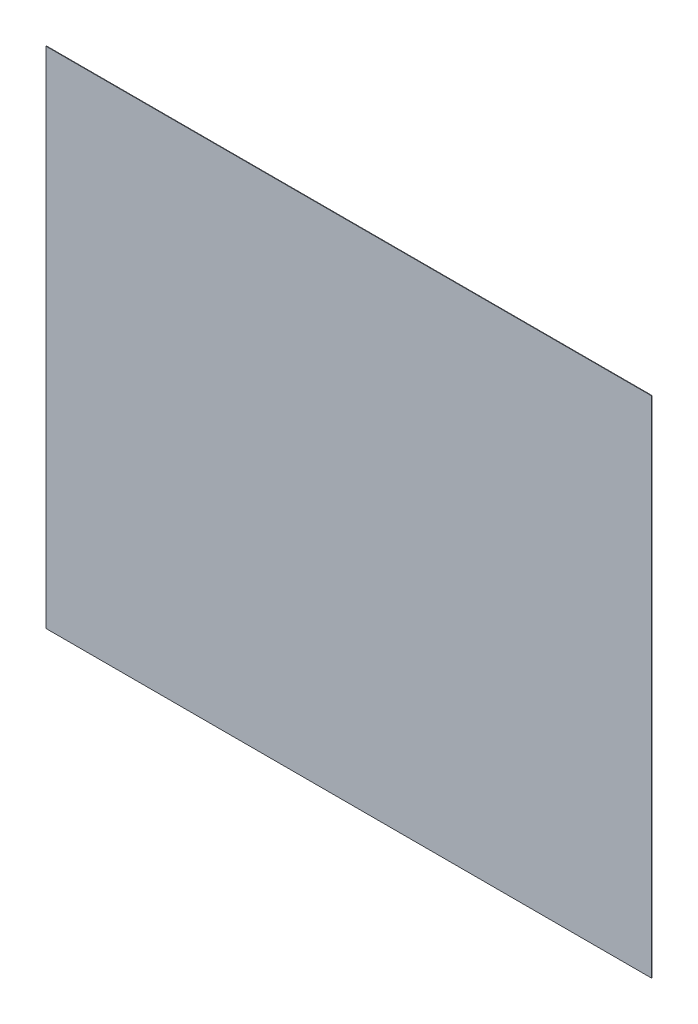
ISO-10303-21;
HEADER;
FILE_DESCRIPTION(('STEP AP214'),'2;1');
FILE_NAME('part.step','',(''),(''),'','','');
FILE_SCHEMA(('AUTOMOTIVE_DESIGN { 1 0 10303 214 1 1 1 1 }'));
ENDSEC;
DATA;
#1=APPLICATION_CONTEXT('core data for automotive mechanical design processes');
#2=APPLICATION_PROTOCOL_DEFINITION('international standard','automotive_design',2000,#1);
#3=PRODUCT_CONTEXT('',#1,'mechanical');
#4=PRODUCT('Part','Part','',(#3));
#5=PRODUCT_RELATED_PRODUCT_CATEGORY('part','',(#4));
#6=PRODUCT_DEFINITION_FORMATION('','',#4);
#7=PRODUCT_DEFINITION_CONTEXT('part definition',#1,'design');
#8=PRODUCT_DEFINITION('design','',#6,#7);
#9=PRODUCT_DEFINITION_SHAPE('','',#8);
#10=(LENGTH_UNIT() NAMED_UNIT(*) SI_UNIT(.MILLI.,.METRE.));
#11=(NAMED_UNIT(*) PLANE_ANGLE_UNIT() SI_UNIT($,.RADIAN.));
#12=(NAMED_UNIT(*) SI_UNIT($,.STERADIAN.) SOLID_ANGLE_UNIT());
#13=UNCERTAINTY_MEASURE_WITH_UNIT(LENGTH_MEASURE(1.E-05),#10,'distance_accuracy_value','');
#14=(GEOMETRIC_REPRESENTATION_CONTEXT(3) GLOBAL_UNCERTAINTY_ASSIGNED_CONTEXT((#13)) GLOBAL_UNIT_ASSIGNED_CONTEXT((#10,
#11,#12)) REPRESENTATION_CONTEXT('',''));
#15=CARTESIAN_POINT('',(0.,0.,0.));
#16=DIRECTION('',(0.,0.,1.));
#17=DIRECTION('',(1.,0.,0.));
#18=AXIS2_PLACEMENT_3D('',#15,#16,#17);
#19=CARTESIAN_POINT('',(0.,0.,0.01));
#20=DIRECTION('',(0.,0.,1.));
#21=DIRECTION('',(1.,0.,0.));
#22=AXIS2_PLACEMENT_3D('',#19,#20,#21);
#23=PLANE('',#22);
#24=DIRECTION('',(1.,0.,0.));
#25=VECTOR('',#24,1.);
#26=CARTESIAN_POINT('',(12.,10.,0.01));
#27=LINE('',#26,#25);
#28=CARTESIAN_POINT('',(0.,10.,0.01));
#29=VERTEX_POINT('',#28);
#30=CARTESIAN_POINT('',(12.,10.,0.01));
#31=VERTEX_POINT('',#30);
#32=EDGE_CURVE('E68',#29,#31,#27,.T.);
#33=ORIENTED_EDGE('',*,*,#32,.F.);
#34=DIRECTION('',(0.,1.,0.));
#35=VECTOR('',#34,1.);
#36=CARTESIAN_POINT('',(0.,10.,0.01));
#37=LINE('',#36,#35);
#38=CARTESIAN_POINT('',(0.,0.,0.01));
#39=VERTEX_POINT('',#38);
#40=EDGE_CURVE('E20',#39,#29,#37,.T.);
#41=ORIENTED_EDGE('',*,*,#40,.F.);
#42=DIRECTION('',(1.,0.,0.));
#43=VECTOR('',#42,1.);
#44=CARTESIAN_POINT('',(0.,0.,0.01));
#45=LINE('',#44,#43);
#46=CARTESIAN_POINT('',(12.,0.,0.01));
#47=VERTEX_POINT('',#46);
#48=EDGE_CURVE('E58',#47,#39,#45,.F.);
#49=ORIENTED_EDGE('',*,*,#48,.F.);
#50=DIRECTION('',(0.,1.,0.));
#51=VECTOR('',#50,1.);
#52=CARTESIAN_POINT('',(12.,0.,0.01));
#53=LINE('',#52,#51);
#54=EDGE_CURVE('E53',#31,#47,#53,.F.);
#55=ORIENTED_EDGE('',*,*,#54,.F.);
#56=EDGE_LOOP('',(#33,#41,#49,#55));
#57=FACE_BOUND('',#56,.T.);
#58=ADVANCED_FACE('F17',(#57),#23,.T.);
#59=CARTESIAN_POINT('',(0.,10.,0.));
#60=DIRECTION('',(-1.,0.,0.));
#61=DIRECTION('',(0.,0.,1.));
#62=AXIS2_PLACEMENT_3D('',#59,#60,#61);
#63=PLANE('',#62);
#64=DIRECTION('',(0.,0.,1.));
#65=VECTOR('',#64,1.);
#66=CARTESIAN_POINT('',(0.,10.,0.));
#67=LINE('',#66,#65);
#68=CARTESIAN_POINT('',(0.,10.,0.));
#69=VERTEX_POINT('',#68);
#70=EDGE_CURVE('E79',#69,#29,#67,.T.);
#71=ORIENTED_EDGE('',*,*,#70,.F.);
#72=DIRECTION('',(0.,1.,0.));
#73=VECTOR('',#72,1.);
#74=CARTESIAN_POINT('',(0.,0.,0.));
#75=LINE('',#74,#73);
#76=CARTESIAN_POINT('',(0.,0.,0.));
#77=VERTEX_POINT('',#76);
#78=EDGE_CURVE('E74',#69,#77,#75,.F.);
#79=ORIENTED_EDGE('',*,*,#78,.T.);
#80=DIRECTION('',(0.,0.,-1.));
#81=VECTOR('',#80,1.);
#82=CARTESIAN_POINT('',(0.,0.,0.));
#83=LINE('',#82,#81);
#84=EDGE_CURVE('E63',#39,#77,#83,.T.);
#85=ORIENTED_EDGE('',*,*,#84,.F.);
#86=ORIENTED_EDGE('',*,*,#40,.T.);
#87=EDGE_LOOP('',(#71,#79,#85,#86));
#88=FACE_BOUND('',#87,.T.);
#89=ADVANCED_FACE('F73',(#88),#63,.T.);
#90=CARTESIAN_POINT('',(0.,0.,0.));
#91=DIRECTION('',(0.,-1.,0.));
#92=DIRECTION('',(0.,0.,-1.));
#93=AXIS2_PLACEMENT_3D('',#90,#91,#92);
#94=PLANE('',#93);
#95=ORIENTED_EDGE('',*,*,#84,.T.);
#96=DIRECTION('',(1.,0.,0.));
#97=VECTOR('',#96,1.);
#98=CARTESIAN_POINT('',(0.,0.,0.));
#99=LINE('',#98,#97);
#100=CARTESIAN_POINT('',(12.,0.,0.));
#101=VERTEX_POINT('',#100);
#102=EDGE_CURVE('E84',#77,#101,#99,.T.);
#103=ORIENTED_EDGE('',*,*,#102,.T.);
#104=DIRECTION('',(0.,0.,-1.));
#105=VECTOR('',#104,1.);
#106=CARTESIAN_POINT('',(12.,0.,0.));
#107=LINE('',#106,#105);
#108=EDGE_CURVE('E65',#47,#101,#107,.T.);
#109=ORIENTED_EDGE('',*,*,#108,.F.);
#110=ORIENTED_EDGE('',*,*,#48,.T.);
#111=EDGE_LOOP('',(#95,#103,#109,#110));
#112=FACE_BOUND('',#111,.T.);
#113=ADVANCED_FACE('F60',(#112),#94,.T.);
#114=CARTESIAN_POINT('',(12.,0.,0.));
#115=DIRECTION('',(1.,0.,0.));
#116=DIRECTION('',(0.,0.,-1.));
#117=AXIS2_PLACEMENT_3D('',#114,#115,#116);
#118=PLANE('',#117);
#119=ORIENTED_EDGE('',*,*,#108,.T.);
#120=DIRECTION('',(0.,1.,0.));
#121=VECTOR('',#120,1.);
#122=CARTESIAN_POINT('',(12.,0.,0.));
#123=LINE('',#122,#121);
#124=CARTESIAN_POINT('',(12.,10.,0.));
#125=VERTEX_POINT('',#124);
#126=EDGE_CURVE('E26',#101,#125,#123,.T.);
#127=ORIENTED_EDGE('',*,*,#126,.T.);
#128=DIRECTION('',(0.,0.,1.));
#129=VECTOR('',#128,1.);
#130=CARTESIAN_POINT('',(12.,10.,0.));
#131=LINE('',#130,#129);
#132=EDGE_CURVE('E34',#31,#125,#131,.F.);
#133=ORIENTED_EDGE('',*,*,#132,.F.);
#134=ORIENTED_EDGE('',*,*,#54,.T.);
#135=EDGE_LOOP('',(#119,#127,#133,#134));
#136=FACE_BOUND('',#135,.T.);
#137=ADVANCED_FACE('F88',(#136),#118,.T.);
#138=CARTESIAN_POINT('',(12.,10.,0.));
#139=DIRECTION('',(0.,1.,0.));
#140=DIRECTION('',(0.,0.,1.));
#141=AXIS2_PLACEMENT_3D('',#138,#139,#140);
#142=PLANE('',#141);
#143=ORIENTED_EDGE('',*,*,#132,.T.);
#144=DIRECTION('',(1.,0.,0.));
#145=VECTOR('',#144,1.);
#146=CARTESIAN_POINT('',(0.,10.,0.));
#147=LINE('',#146,#145);
#148=EDGE_CURVE('E11',#125,#69,#147,.F.);
#149=ORIENTED_EDGE('',*,*,#148,.T.);
#150=ORIENTED_EDGE('',*,*,#70,.T.);
#151=ORIENTED_EDGE('',*,*,#32,.T.);
#152=EDGE_LOOP('',(#143,#149,#150,#151));
#153=FACE_BOUND('',#152,.T.);
#154=ADVANCED_FACE('F91',(#153),#142,.T.);
#155=CARTESIAN_POINT('',(0.,0.,0.));
#156=DIRECTION('',(0.,0.,1.));
#157=DIRECTION('',(1.,0.,0.));
#158=AXIS2_PLACEMENT_3D('',#155,#156,#157);
#159=PLANE('',#158);
#160=ORIENTED_EDGE('',*,*,#126,.F.);
#161=ORIENTED_EDGE('',*,*,#102,.F.);
#162=ORIENTED_EDGE('',*,*,#78,.F.);
#163=ORIENTED_EDGE('',*,*,#148,.F.);
#164=EDGE_LOOP('',(#160,#161,#162,#163));
#165=FACE_BOUND('',#164,.T.);
#166=ADVANCED_FACE('F90',(#165),#159,.F.);
#167=CLOSED_SHELL('',(#58,#89,#113,#137,#154,#166));
#168=MANIFOLD_SOLID_BREP('B1',#167);
#169=ADVANCED_BREP_SHAPE_REPRESENTATION('',(#18,#168),#14);
#170=SHAPE_DEFINITION_REPRESENTATION(#9,#169);
ENDSEC;
END-ISO-10303-21;
